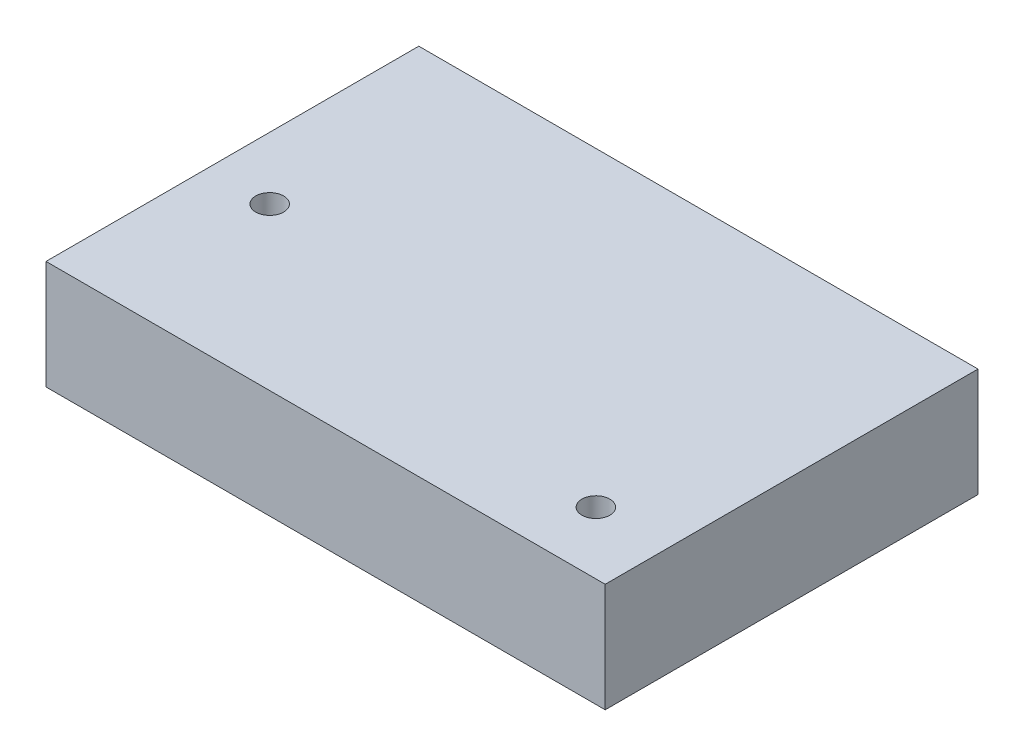
ISO-10303-21;
HEADER;
FILE_DESCRIPTION(('STEP AP214'),'2;1');
FILE_NAME('part.step','',(''),(''),'','','');
FILE_SCHEMA(('AUTOMOTIVE_DESIGN { 1 0 10303 214 1 1 1 1 }'));
ENDSEC;
DATA;
#1=APPLICATION_CONTEXT('core data for automotive mechanical design processes');
#2=APPLICATION_PROTOCOL_DEFINITION('international standard','automotive_design',2000,#1);
#3=PRODUCT_CONTEXT('',#1,'mechanical');
#4=PRODUCT('Part','Part','',(#3));
#5=PRODUCT_RELATED_PRODUCT_CATEGORY('part','',(#4));
#6=PRODUCT_DEFINITION_FORMATION('','',#4);
#7=PRODUCT_DEFINITION_CONTEXT('part definition',#1,'design');
#8=PRODUCT_DEFINITION('design','',#6,#7);
#9=PRODUCT_DEFINITION_SHAPE('','',#8);
#10=(LENGTH_UNIT() NAMED_UNIT(*) SI_UNIT(.MILLI.,.METRE.));
#11=(NAMED_UNIT(*) PLANE_ANGLE_UNIT() SI_UNIT($,.RADIAN.));
#12=(NAMED_UNIT(*) SI_UNIT($,.STERADIAN.) SOLID_ANGLE_UNIT());
#13=UNCERTAINTY_MEASURE_WITH_UNIT(LENGTH_MEASURE(1.E-05),#10,'distance_accuracy_value','');
#14=(GEOMETRIC_REPRESENTATION_CONTEXT(3) GLOBAL_UNCERTAINTY_ASSIGNED_CONTEXT((#13)) GLOBAL_UNIT_ASSIGNED_CONTEXT((#10,
#11,#12)) REPRESENTATION_CONTEXT('',''));
#15=CARTESIAN_POINT('',(0.,0.,0.));
#16=DIRECTION('',(0.,0.,1.));
#17=DIRECTION('',(1.,0.,0.));
#18=AXIS2_PLACEMENT_3D('',#15,#16,#17);
#19=CARTESIAN_POINT('',(0.,0.,0.));
#20=DIRECTION('',(0.,-1.,0.));
#21=DIRECTION('',(0.,0.,-1.));
#22=AXIS2_PLACEMENT_3D('',#19,#20,#21);
#23=PLANE('',#22);
#24=DIRECTION('',(0.,0.,-1.));
#25=VECTOR('',#24,1.);
#26=CARTESIAN_POINT('',(90.,0.,60.));
#27=LINE('',#26,#25);
#28=CARTESIAN_POINT('',(90.,0.,60.));
#29=VERTEX_POINT('',#28);
#30=CARTESIAN_POINT('',(90.,0.,-60.));
#31=VERTEX_POINT('',#30);
#32=EDGE_CURVE('E216',#29,#31,#27,.T.);
#33=ORIENTED_EDGE('',*,*,#32,.F.);
#34=DIRECTION('',(1.,0.,0.));
#35=VECTOR('',#34,1.);
#36=CARTESIAN_POINT('',(-90.,0.,60.));
#37=LINE('',#36,#35);
#38=CARTESIAN_POINT('',(-90.,0.,60.));
#39=VERTEX_POINT('',#38);
#40=EDGE_CURVE('E86',#39,#29,#37,.T.);
#41=ORIENTED_EDGE('',*,*,#40,.F.);
#42=DIRECTION('',(0.,0.,1.));
#43=VECTOR('',#42,1.);
#44=CARTESIAN_POINT('',(-90.,0.,60.));
#45=LINE('',#44,#43);
#46=CARTESIAN_POINT('',(-90.,0.,-60.));
#47=VERTEX_POINT('',#46);
#48=EDGE_CURVE('E228',#47,#39,#45,.T.);
#49=ORIENTED_EDGE('',*,*,#48,.F.);
#50=DIRECTION('',(-1.,0.,0.));
#51=VECTOR('',#50,1.);
#52=CARTESIAN_POINT('',(-90.,0.,-60.));
#53=LINE('',#52,#51);
#54=EDGE_CURVE('E226',#31,#47,#53,.T.);
#55=ORIENTED_EDGE('',*,*,#54,.F.);
#56=EDGE_LOOP('',(#33,#41,#49,#55));
#57=FACE_BOUND('',#56,.T.);
#58=DIRECTION('',(1.,0.,0.));
#59=VECTOR('',#58,1.);
#60=CARTESIAN_POINT('',(-75.,0.,0.));
#61=LINE('',#60,#59);
#62=CARTESIAN_POINT('',(-75.,0.,0.));
#63=VERTEX_POINT('',#62);
#64=CARTESIAN_POINT('',(-68.,0.,0.));
#65=VERTEX_POINT('',#64);
#66=EDGE_CURVE('E199',#63,#65,#61,.T.);
#67=ORIENTED_EDGE('',*,*,#66,.F.);
#68=DIRECTION('',(0.,0.,1.));
#69=VECTOR('',#68,1.);
#70=CARTESIAN_POINT('',(-75.,0.,35.));
#71=LINE('',#70,#69);
#72=CARTESIAN_POINT('',(-75.,0.,45.));
#73=VERTEX_POINT('',#72);
#74=EDGE_CURVE('E151',#63,#73,#71,.T.);
#75=ORIENTED_EDGE('',*,*,#74,.T.);
#76=DIRECTION('',(-1.,0.,0.));
#77=VECTOR('',#76,1.);
#78=CARTESIAN_POINT('',(0.,0.,45.));
#79=LINE('',#78,#77);
#80=CARTESIAN_POINT('',(75.,0.,45.));
#81=VERTEX_POINT('',#80);
#82=EDGE_CURVE('E166',#81,#73,#79,.T.);
#83=ORIENTED_EDGE('',*,*,#82,.F.);
#84=DIRECTION('',(0.,0.,-1.));
#85=VECTOR('',#84,1.);
#86=CARTESIAN_POINT('',(75.,0.,35.));
#87=LINE('',#86,#85);
#88=CARTESIAN_POINT('',(75.,0.,35.));
#89=VERTEX_POINT('',#88);
#90=EDGE_CURVE('E157',#81,#89,#87,.T.);
#91=ORIENTED_EDGE('',*,*,#90,.T.);
#92=DIRECTION('',(1.,0.,0.));
#93=VECTOR('',#92,1.);
#94=CARTESIAN_POINT('',(-75.,0.,35.));
#95=LINE('',#94,#93);
#96=CARTESIAN_POINT('',(-62.,0.,35.));
#97=VERTEX_POINT('',#96);
#98=EDGE_CURVE('E140',#97,#89,#95,.T.);
#99=ORIENTED_EDGE('',*,*,#98,.F.);
#100=CARTESIAN_POINT('',(-62.,0.,32.));
#101=DIRECTION('',(0.,1.,0.));
#102=DIRECTION('',(0.,0.,1.));
#103=AXIS2_PLACEMENT_3D('',#100,#101,#102);
#104=CIRCLE('',#103,3.);
#105=CARTESIAN_POINT('',(-65.,0.,32.));
#106=VERTEX_POINT('',#105);
#107=EDGE_CURVE('E212',#106,#97,#104,.T.);
#108=ORIENTED_EDGE('',*,*,#107,.F.);
#109=DIRECTION('',(0.,0.,1.));
#110=VECTOR('',#109,1.);
#111=CARTESIAN_POINT('',(-65.,0.,45.));
#112=LINE('',#111,#110);
#113=CARTESIAN_POINT('',(-65.,0.,2.99999999999999));
#114=VERTEX_POINT('',#113);
#115=EDGE_CURVE('E150',#114,#106,#112,.T.);
#116=ORIENTED_EDGE('',*,*,#115,.F.);
#117=CARTESIAN_POINT('',(-68.,0.,2.99999999999998));
#118=DIRECTION('',(0.,1.,0.));
#119=DIRECTION('',(0.,0.,1.));
#120=AXIS2_PLACEMENT_3D('',#117,#118,#119);
#121=CIRCLE('',#120,3.);
#122=EDGE_CURVE('E208',#65,#114,#121,.F.);
#123=ORIENTED_EDGE('',*,*,#122,.F.);
#124=EDGE_LOOP('',(#67,#75,#83,#91,#99,#108,#116,#123));
#125=FACE_BOUND('',#124,.T.);
#126=ADVANCED_FACE('F41',(#57,#125),#23,.T.);
#127=CARTESIAN_POINT('',(90.,35.,60.));
#128=DIRECTION('',(-1.,0.,0.));
#129=DIRECTION('',(0.,0.,1.));
#130=AXIS2_PLACEMENT_3D('',#127,#128,#129);
#131=PLANE('',#130);
#132=ORIENTED_EDGE('',*,*,#32,.T.);
#133=DIRECTION('',(0.,-1.,0.));
#134=VECTOR('',#133,1.);
#135=CARTESIAN_POINT('',(90.,35.,-60.));
#136=LINE('',#135,#134);
#137=CARTESIAN_POINT('',(90.,35.,-60.));
#138=VERTEX_POINT('',#137);
#139=EDGE_CURVE('E11',#138,#31,#136,.T.);
#140=ORIENTED_EDGE('',*,*,#139,.F.);
#141=DIRECTION('',(0.,0.,-1.));
#142=VECTOR('',#141,1.);
#143=CARTESIAN_POINT('',(90.,35.,60.));
#144=LINE('',#143,#142);
#145=CARTESIAN_POINT('',(90.,35.,60.));
#146=VERTEX_POINT('',#145);
#147=EDGE_CURVE('E217',#146,#138,#144,.T.);
#148=ORIENTED_EDGE('',*,*,#147,.F.);
#149=DIRECTION('',(0.,-1.,0.));
#150=VECTOR('',#149,1.);
#151=CARTESIAN_POINT('',(90.,35.,60.));
#152=LINE('',#151,#150);
#153=EDGE_CURVE('E223',#146,#29,#152,.T.);
#154=ORIENTED_EDGE('',*,*,#153,.T.);
#155=EDGE_LOOP('',(#132,#140,#148,#154));
#156=FACE_BOUND('',#155,.T.);
#157=ADVANCED_FACE('F43',(#156),#131,.F.);
#158=CARTESIAN_POINT('',(-90.,35.,-60.));
#159=DIRECTION('',(0.,0.,1.));
#160=DIRECTION('',(1.,0.,0.));
#161=AXIS2_PLACEMENT_3D('',#158,#159,#160);
#162=PLANE('',#161);
#163=ORIENTED_EDGE('',*,*,#54,.T.);
#164=DIRECTION('',(0.,-1.,0.));
#165=VECTOR('',#164,1.);
#166=CARTESIAN_POINT('',(-90.,35.,-60.));
#167=LINE('',#166,#165);
#168=CARTESIAN_POINT('',(-90.,35.,-60.));
#169=VERTEX_POINT('',#168);
#170=EDGE_CURVE('E49',#169,#47,#167,.T.);
#171=ORIENTED_EDGE('',*,*,#170,.F.);
#172=DIRECTION('',(-1.,0.,0.));
#173=VECTOR('',#172,1.);
#174=CARTESIAN_POINT('',(-90.,35.,-60.));
#175=LINE('',#174,#173);
#176=EDGE_CURVE('E93',#138,#169,#175,.T.);
#177=ORIENTED_EDGE('',*,*,#176,.F.);
#178=ORIENTED_EDGE('',*,*,#139,.T.);
#179=EDGE_LOOP('',(#163,#171,#177,#178));
#180=FACE_BOUND('',#179,.T.);
#181=ADVANCED_FACE('F255',(#180),#162,.F.);
#182=CARTESIAN_POINT('',(-90.,35.,60.));
#183=DIRECTION('',(1.,0.,0.));
#184=DIRECTION('',(0.,0.,-1.));
#185=AXIS2_PLACEMENT_3D('',#182,#183,#184);
#186=PLANE('',#185);
#187=ORIENTED_EDGE('',*,*,#48,.T.);
#188=DIRECTION('',(0.,-1.,0.));
#189=VECTOR('',#188,1.);
#190=CARTESIAN_POINT('',(-90.,35.,60.));
#191=LINE('',#190,#189);
#192=CARTESIAN_POINT('',(-90.,35.,60.));
#193=VERTEX_POINT('',#192);
#194=EDGE_CURVE('E232',#193,#39,#191,.T.);
#195=ORIENTED_EDGE('',*,*,#194,.F.);
#196=DIRECTION('',(0.,0.,1.));
#197=VECTOR('',#196,1.);
#198=CARTESIAN_POINT('',(-90.,35.,60.));
#199=LINE('',#198,#197);
#200=EDGE_CURVE('E220',#169,#193,#199,.T.);
#201=ORIENTED_EDGE('',*,*,#200,.F.);
#202=ORIENTED_EDGE('',*,*,#170,.T.);
#203=EDGE_LOOP('',(#187,#195,#201,#202));
#204=FACE_BOUND('',#203,.T.);
#205=ADVANCED_FACE('F237',(#204),#186,.F.);
#206=CARTESIAN_POINT('',(-90.,35.,60.));
#207=DIRECTION('',(0.,0.,-1.));
#208=DIRECTION('',(-1.,0.,0.));
#209=AXIS2_PLACEMENT_3D('',#206,#207,#208);
#210=PLANE('',#209);
#211=ORIENTED_EDGE('',*,*,#40,.T.);
#212=ORIENTED_EDGE('',*,*,#153,.F.);
#213=DIRECTION('',(1.,0.,0.));
#214=VECTOR('',#213,1.);
#215=CARTESIAN_POINT('',(-90.,35.,60.));
#216=LINE('',#215,#214);
#217=EDGE_CURVE('E65',#193,#146,#216,.T.);
#218=ORIENTED_EDGE('',*,*,#217,.F.);
#219=ORIENTED_EDGE('',*,*,#194,.T.);
#220=EDGE_LOOP('',(#211,#212,#218,#219));
#221=FACE_BOUND('',#220,.T.);
#222=ADVANCED_FACE('F244',(#221),#210,.F.);
#223=CARTESIAN_POINT('',(0.,35.,0.));
#224=DIRECTION('',(0.,-1.,0.));
#225=DIRECTION('',(0.,0.,-1.));
#226=AXIS2_PLACEMENT_3D('',#223,#224,#225);
#227=PLANE('',#226);
#228=CARTESIAN_POINT('',(-70.,35.,8.));
#229=DIRECTION('',(0.,-1.,0.));
#230=DIRECTION('',(0.,0.,-1.));
#231=AXIS2_PLACEMENT_3D('',#228,#229,#230);
#232=CIRCLE('',#231,4.5);
#233=CARTESIAN_POINT('',(-70.,35.,3.49999999999999));
#234=VERTEX_POINT('',#233);
#235=EDGE_CURVE('E167',#234,#234,#232,.T.);
#236=ORIENTED_EDGE('',*,*,#235,.T.);
#237=EDGE_LOOP('',(#236));
#238=FACE_BOUND('',#237,.T.);
#239=CARTESIAN_POINT('',(67.,35.,40.));
#240=DIRECTION('',(0.,-1.,0.));
#241=DIRECTION('',(0.,0.,-1.));
#242=AXIS2_PLACEMENT_3D('',#239,#240,#241);
#243=CIRCLE('',#242,4.50000000000001);
#244=CARTESIAN_POINT('',(67.,35.,35.5));
#245=VERTEX_POINT('',#244);
#246=EDGE_CURVE('E175',#245,#245,#243,.T.);
#247=ORIENTED_EDGE('',*,*,#246,.T.);
#248=EDGE_LOOP('',(#247));
#249=FACE_BOUND('',#248,.T.);
#250=ORIENTED_EDGE('',*,*,#147,.T.);
#251=ORIENTED_EDGE('',*,*,#176,.T.);
#252=ORIENTED_EDGE('',*,*,#200,.T.);
#253=ORIENTED_EDGE('',*,*,#217,.T.);
#254=EDGE_LOOP('',(#250,#251,#252,#253));
#255=FACE_BOUND('',#254,.T.);
#256=ADVANCED_FACE('F246',(#238,#249,#255),#227,.F.);
#257=CARTESIAN_POINT('',(0.,-20.,35.));
#258=DIRECTION('',(0.,0.,1.));
#259=DIRECTION('',(-1.,0.,0.));
#260=AXIS2_PLACEMENT_3D('',#257,#258,#259);
#261=PLANE('',#260);
#262=ORIENTED_EDGE('',*,*,#98,.T.);
#263=DIRECTION('',(0.,-1.,0.));
#264=VECTOR('',#263,1.);
#265=CARTESIAN_POINT('',(75.,21.,35.));
#266=LINE('',#265,#264);
#267=CARTESIAN_POINT('',(75.,21.,35.));
#268=VERTEX_POINT('',#267);
#269=EDGE_CURVE('E144',#268,#89,#266,.T.);
#270=ORIENTED_EDGE('',*,*,#269,.F.);
#271=DIRECTION('',(1.,0.,0.));
#272=VECTOR('',#271,1.);
#273=CARTESIAN_POINT('',(75.,21.,35.));
#274=LINE('',#273,#272);
#275=CARTESIAN_POINT('',(-62.,21.,35.));
#276=VERTEX_POINT('',#275);
#277=EDGE_CURVE('E161',#276,#268,#274,.T.);
#278=ORIENTED_EDGE('',*,*,#277,.F.);
#279=DIRECTION('',(0.,1.,0.));
#280=VECTOR('',#279,1.);
#281=CARTESIAN_POINT('',(-62.,-20.,35.));
#282=LINE('',#281,#280);
#283=EDGE_CURVE('E146',#97,#276,#282,.T.);
#284=ORIENTED_EDGE('',*,*,#283,.F.);
#285=EDGE_LOOP('',(#262,#270,#278,#284));
#286=FACE_BOUND('',#285,.T.);
#287=ADVANCED_FACE('F142',(#286),#261,.T.);
#288=CARTESIAN_POINT('',(-65.,21.,45.));
#289=DIRECTION('',(1.,0.,0.));
#290=DIRECTION('',(0.,-1.,0.));
#291=AXIS2_PLACEMENT_3D('',#288,#289,#290);
#292=PLANE('',#291);
#293=DIRECTION('',(0.,0.,1.));
#294=VECTOR('',#293,1.);
#295=CARTESIAN_POINT('',(-65.,21.,45.));
#296=LINE('',#295,#294);
#297=CARTESIAN_POINT('',(-65.,21.,3.));
#298=VERTEX_POINT('',#297);
#299=CARTESIAN_POINT('',(-65.,21.,32.));
#300=VERTEX_POINT('',#299);
#301=EDGE_CURVE('E182',#298,#300,#296,.T.);
#302=ORIENTED_EDGE('',*,*,#301,.F.);
#303=DIRECTION('',(0.,-1.,0.));
#304=VECTOR('',#303,1.);
#305=CARTESIAN_POINT('',(-65.,21.,2.99999999999998));
#306=LINE('',#305,#304);
#307=EDGE_CURVE('E204',#114,#298,#306,.F.);
#308=ORIENTED_EDGE('',*,*,#307,.F.);
#309=ORIENTED_EDGE('',*,*,#115,.T.);
#310=DIRECTION('',(0.,1.,0.));
#311=VECTOR('',#310,1.);
#312=CARTESIAN_POINT('',(-65.,21.,32.));
#313=LINE('',#312,#311);
#314=EDGE_CURVE('E56',#300,#106,#313,.F.);
#315=ORIENTED_EDGE('',*,*,#314,.F.);
#316=EDGE_LOOP('',(#302,#308,#309,#315));
#317=FACE_BOUND('',#316,.T.);
#318=ADVANCED_FACE('F287',(#317),#292,.F.);
#319=CARTESIAN_POINT('',(-75.,21.,0.));
#320=DIRECTION('',(0.,0.,-1.));
#321=DIRECTION('',(1.,0.,0.));
#322=AXIS2_PLACEMENT_3D('',#319,#320,#321);
#323=PLANE('',#322);
#324=DIRECTION('',(1.,0.,0.));
#325=VECTOR('',#324,1.);
#326=CARTESIAN_POINT('',(-75.,21.,0.));
#327=LINE('',#326,#325);
#328=CARTESIAN_POINT('',(-75.,21.,0.));
#329=VERTEX_POINT('',#328);
#330=CARTESIAN_POINT('',(-68.,21.,0.));
#331=VERTEX_POINT('',#330);
#332=EDGE_CURVE('E179',#329,#331,#327,.T.);
#333=ORIENTED_EDGE('',*,*,#332,.F.);
#334=DIRECTION('',(0.,-1.,0.));
#335=VECTOR('',#334,1.);
#336=CARTESIAN_POINT('',(-75.,21.,0.));
#337=LINE('',#336,#335);
#338=EDGE_CURVE('E185',#329,#63,#337,.T.);
#339=ORIENTED_EDGE('',*,*,#338,.T.);
#340=ORIENTED_EDGE('',*,*,#66,.T.);
#341=DIRECTION('',(0.,-1.,0.));
#342=VECTOR('',#341,1.);
#343=CARTESIAN_POINT('',(-68.,21.,0.));
#344=LINE('',#343,#342);
#345=EDGE_CURVE('E201',#331,#65,#344,.T.);
#346=ORIENTED_EDGE('',*,*,#345,.F.);
#347=EDGE_LOOP('',(#333,#339,#340,#346));
#348=FACE_BOUND('',#347,.T.);
#349=ADVANCED_FACE('F276',(#348),#323,.F.);
#350=CARTESIAN_POINT('',(-75.,21.,35.));
#351=DIRECTION('',(1.,0.,0.));
#352=DIRECTION('',(0.,-1.,0.));
#353=AXIS2_PLACEMENT_3D('',#350,#351,#352);
#354=PLANE('',#353);
#355=ORIENTED_EDGE('',*,*,#338,.F.);
#356=DIRECTION('',(0.,0.,1.));
#357=VECTOR('',#356,1.);
#358=CARTESIAN_POINT('',(-75.,21.,35.));
#359=LINE('',#358,#357);
#360=CARTESIAN_POINT('',(-75.,21.,45.));
#361=VERTEX_POINT('',#360);
#362=EDGE_CURVE('E196',#329,#361,#359,.T.);
#363=ORIENTED_EDGE('',*,*,#362,.T.);
#364=DIRECTION('',(0.,1.,0.));
#365=VECTOR('',#364,1.);
#366=CARTESIAN_POINT('',(-75.,21.,45.));
#367=LINE('',#366,#365);
#368=EDGE_CURVE('E188',#73,#361,#367,.T.);
#369=ORIENTED_EDGE('',*,*,#368,.F.);
#370=ORIENTED_EDGE('',*,*,#74,.F.);
#371=EDGE_LOOP('',(#355,#363,#369,#370));
#372=FACE_BOUND('',#371,.T.);
#373=ADVANCED_FACE('F272',(#372),#354,.T.);
#374=CARTESIAN_POINT('',(75.,21.,35.));
#375=DIRECTION('',(0.,-1.,0.));
#376=DIRECTION('',(-1.,0.,0.));
#377=AXIS2_PLACEMENT_3D('',#374,#375,#376);
#378=PLANE('',#377);
#379=CARTESIAN_POINT('',(-70.,21.,7.99999999999999));
#380=DIRECTION('',(0.,-1.,0.));
#381=DIRECTION('',(0.,0.,-1.));
#382=AXIS2_PLACEMENT_3D('',#379,#380,#381);
#383=CIRCLE('',#382,4.5);
#384=CARTESIAN_POINT('',(-70.,21.,3.49999999999999));
#385=VERTEX_POINT('',#384);
#386=EDGE_CURVE('E171',#385,#385,#383,.T.);
#387=ORIENTED_EDGE('',*,*,#386,.F.);
#388=EDGE_LOOP('',(#387));
#389=FACE_BOUND('',#388,.T.);
#390=CARTESIAN_POINT('',(67.,21.,40.));
#391=DIRECTION('',(0.,-1.,0.));
#392=DIRECTION('',(0.,0.,-1.));
#393=AXIS2_PLACEMENT_3D('',#390,#391,#392);
#394=CIRCLE('',#393,4.50000000000001);
#395=CARTESIAN_POINT('',(67.,21.,35.5));
#396=VERTEX_POINT('',#395);
#397=EDGE_CURVE('E306',#396,#396,#394,.T.);
#398=ORIENTED_EDGE('',*,*,#397,.F.);
#399=EDGE_LOOP('',(#398));
#400=FACE_BOUND('',#399,.T.);
#401=ORIENTED_EDGE('',*,*,#301,.T.);
#402=CARTESIAN_POINT('',(-62.,21.,32.));
#403=DIRECTION('',(0.,-1.,0.));
#404=DIRECTION('',(-1.,0.,0.));
#405=AXIS2_PLACEMENT_3D('',#402,#403,#404);
#406=CIRCLE('',#405,3.);
#407=EDGE_CURVE('E214',#276,#300,#406,.T.);
#408=ORIENTED_EDGE('',*,*,#407,.F.);
#409=ORIENTED_EDGE('',*,*,#277,.T.);
#410=DIRECTION('',(0.,0.,1.));
#411=VECTOR('',#410,1.);
#412=CARTESIAN_POINT('',(75.,21.,35.));
#413=LINE('',#412,#411);
#414=CARTESIAN_POINT('',(75.,21.,45.));
#415=VERTEX_POINT('',#414);
#416=EDGE_CURVE('E160',#268,#415,#413,.T.);
#417=ORIENTED_EDGE('',*,*,#416,.T.);
#418=DIRECTION('',(1.,0.,0.));
#419=VECTOR('',#418,1.);
#420=CARTESIAN_POINT('',(75.,21.,45.));
#421=LINE('',#420,#419);
#422=EDGE_CURVE('E192',#361,#415,#421,.T.);
#423=ORIENTED_EDGE('',*,*,#422,.F.);
#424=ORIENTED_EDGE('',*,*,#362,.F.);
#425=ORIENTED_EDGE('',*,*,#332,.T.);
#426=CARTESIAN_POINT('',(-68.,21.,2.99999999999998));
#427=DIRECTION('',(0.,-1.,0.));
#428=DIRECTION('',(-1.,0.,0.));
#429=AXIS2_PLACEMENT_3D('',#426,#427,#428);
#430=CIRCLE('',#429,3.);
#431=EDGE_CURVE('E206',#298,#331,#430,.F.);
#432=ORIENTED_EDGE('',*,*,#431,.F.);
#433=EDGE_LOOP('',(#401,#408,#409,#417,#423,#424,#425,#432));
#434=FACE_BOUND('',#433,.T.);
#435=ADVANCED_FACE('F275',(#389,#400,#434),#378,.T.);
#436=CARTESIAN_POINT('',(75.,21.,35.));
#437=DIRECTION('',(-1.,0.,0.));
#438=DIRECTION('',(0.,1.,0.));
#439=AXIS2_PLACEMENT_3D('',#436,#437,#438);
#440=PLANE('',#439);
#441=DIRECTION('',(0.,-1.,0.));
#442=VECTOR('',#441,1.);
#443=CARTESIAN_POINT('',(75.,21.,45.));
#444=LINE('',#443,#442);
#445=EDGE_CURVE('E189',#415,#81,#444,.T.);
#446=ORIENTED_EDGE('',*,*,#445,.F.);
#447=ORIENTED_EDGE('',*,*,#416,.F.);
#448=ORIENTED_EDGE('',*,*,#269,.T.);
#449=ORIENTED_EDGE('',*,*,#90,.F.);
#450=EDGE_LOOP('',(#446,#447,#448,#449));
#451=FACE_BOUND('',#450,.T.);
#452=ADVANCED_FACE('F156',(#451),#440,.T.);
#453=CARTESIAN_POINT('',(0.,-20.,45.));
#454=DIRECTION('',(0.,0.,1.));
#455=DIRECTION('',(-1.,0.,0.));
#456=AXIS2_PLACEMENT_3D('',#453,#454,#455);
#457=PLANE('',#456);
#458=ORIENTED_EDGE('',*,*,#82,.T.);
#459=ORIENTED_EDGE('',*,*,#368,.T.);
#460=ORIENTED_EDGE('',*,*,#422,.T.);
#461=ORIENTED_EDGE('',*,*,#445,.T.);
#462=EDGE_LOOP('',(#458,#459,#460,#461));
#463=FACE_BOUND('',#462,.T.);
#464=ADVANCED_FACE('F270',(#463),#457,.F.);
#465=CARTESIAN_POINT('',(-68.,21.,2.99999999999998));
#466=DIRECTION('',(0.,-1.,0.));
#467=DIRECTION('',(-1.,0.,0.));
#468=AXIS2_PLACEMENT_3D('',#465,#466,#467);
#469=CYLINDRICAL_SURFACE('',#468,3.);
#470=ORIENTED_EDGE('',*,*,#431,.T.);
#471=ORIENTED_EDGE('',*,*,#345,.T.);
#472=ORIENTED_EDGE('',*,*,#122,.T.);
#473=ORIENTED_EDGE('',*,*,#307,.T.);
#474=EDGE_LOOP('',(#470,#471,#472,#473));
#475=FACE_BOUND('',#474,.T.);
#476=ADVANCED_FACE('F267',(#475),#469,.F.);
#477=CARTESIAN_POINT('',(-62.,-20.,32.));
#478=DIRECTION('',(0.,1.,0.));
#479=DIRECTION('',(1.,0.,0.));
#480=AXIS2_PLACEMENT_3D('',#477,#478,#479);
#481=CYLINDRICAL_SURFACE('',#480,3.);
#482=ORIENTED_EDGE('',*,*,#107,.T.);
#483=ORIENTED_EDGE('',*,*,#283,.T.);
#484=ORIENTED_EDGE('',*,*,#407,.T.);
#485=ORIENTED_EDGE('',*,*,#314,.T.);
#486=EDGE_LOOP('',(#482,#483,#484,#485));
#487=FACE_BOUND('',#486,.T.);
#488=ADVANCED_FACE('F263',(#487),#481,.T.);
#489=CARTESIAN_POINT('',(67.,35.,40.));
#490=DIRECTION('',(0.,-1.,0.));
#491=DIRECTION('',(0.,0.,-1.));
#492=AXIS2_PLACEMENT_3D('',#489,#490,#491);
#493=CYLINDRICAL_SURFACE('',#492,4.50000000000001);
#494=ORIENTED_EDGE('',*,*,#246,.F.);
#495=EDGE_LOOP('',(#494));
#496=FACE_BOUND('',#495,.T.);
#497=ORIENTED_EDGE('',*,*,#397,.T.);
#498=EDGE_LOOP('',(#497));
#499=FACE_BOUND('',#498,.T.);
#500=ADVANCED_FACE('F266',(#496,#499),#493,.F.);
#501=CARTESIAN_POINT('',(-70.,35.,8.));
#502=DIRECTION('',(0.,-1.,0.));
#503=DIRECTION('',(0.,0.,-1.));
#504=AXIS2_PLACEMENT_3D('',#501,#502,#503);
#505=CYLINDRICAL_SURFACE('',#504,4.5);
#506=ORIENTED_EDGE('',*,*,#235,.F.);
#507=EDGE_LOOP('',(#506));
#508=FACE_BOUND('',#507,.T.);
#509=ORIENTED_EDGE('',*,*,#386,.T.);
#510=EDGE_LOOP('',(#509));
#511=FACE_BOUND('',#510,.T.);
#512=ADVANCED_FACE('F296',(#508,#511),#505,.F.);
#513=CLOSED_SHELL('',(#126,#157,#181,#205,#222,#256,#287,#318,#349,#373,#435,#452,#464,#476,
#488,#500,#512));
#514=MANIFOLD_SOLID_BREP('B2',#513);
#515=ADVANCED_BREP_SHAPE_REPRESENTATION('',(#18,#514),#14);
#516=SHAPE_DEFINITION_REPRESENTATION(#9,#515);
ENDSEC;
END-ISO-10303-21;
